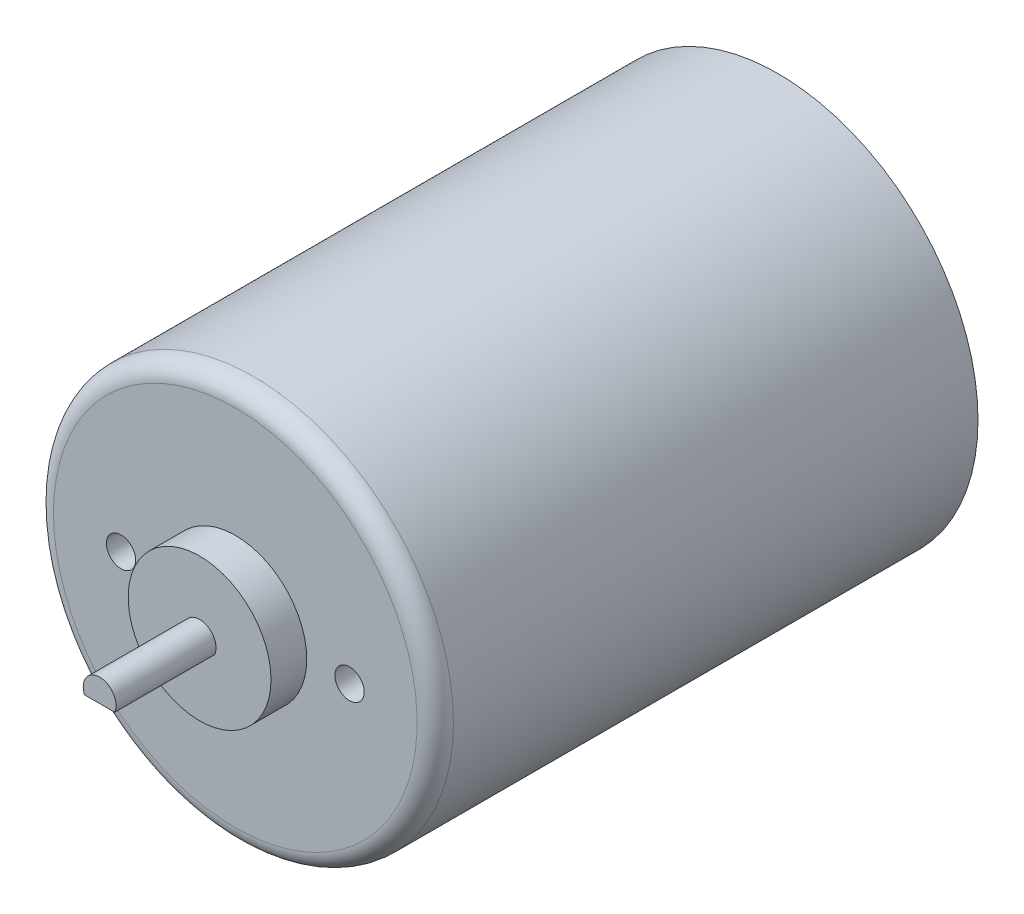
ISO-10303-21;
HEADER;
FILE_DESCRIPTION(('STEP AP214'),'2;1');
FILE_NAME('part.step','',(''),(''),'','','');
FILE_SCHEMA(('AUTOMOTIVE_DESIGN { 1 0 10303 214 1 1 1 1 }'));
ENDSEC;
DATA;
#1=APPLICATION_CONTEXT('core data for automotive mechanical design processes');
#2=APPLICATION_PROTOCOL_DEFINITION('international standard','automotive_design',2000,#1);
#3=PRODUCT_CONTEXT('',#1,'mechanical');
#4=PRODUCT('Part','Part','',(#3));
#5=PRODUCT_RELATED_PRODUCT_CATEGORY('part','',(#4));
#6=PRODUCT_DEFINITION_FORMATION('','',#4);
#7=PRODUCT_DEFINITION_CONTEXT('part definition',#1,'design');
#8=PRODUCT_DEFINITION('design','',#6,#7);
#9=PRODUCT_DEFINITION_SHAPE('','',#8);
#10=(LENGTH_UNIT() NAMED_UNIT(*) SI_UNIT(.MILLI.,.METRE.));
#11=(NAMED_UNIT(*) PLANE_ANGLE_UNIT() SI_UNIT($,.RADIAN.));
#12=(NAMED_UNIT(*) SI_UNIT($,.STERADIAN.) SOLID_ANGLE_UNIT());
#13=UNCERTAINTY_MEASURE_WITH_UNIT(LENGTH_MEASURE(1.E-05),#10,'distance_accuracy_value','');
#14=(GEOMETRIC_REPRESENTATION_CONTEXT(3) GLOBAL_UNCERTAINTY_ASSIGNED_CONTEXT((#13)) GLOBAL_UNIT_ASSIGNED_CONTEXT((#10,
#11,#12)) REPRESENTATION_CONTEXT('',''));
#15=CARTESIAN_POINT('',(0.,0.,0.));
#16=DIRECTION('',(0.,0.,1.));
#17=DIRECTION('',(1.,0.,0.));
#18=AXIS2_PLACEMENT_3D('',#15,#16,#17);
#19=CARTESIAN_POINT('',(0.,0.,2.5));
#20=DIRECTION('',(0.,0.,-1.));
#21=DIRECTION('',(-1.,0.,0.));
#22=AXIS2_PLACEMENT_3D('',#19,#20,#21);
#23=PLANE('',#22);
#24=CARTESIAN_POINT('',(0.,0.,2.5));
#25=DIRECTION('',(0.,0.,1.));
#26=DIRECTION('',(1.,0.,0.));
#27=AXIS2_PLACEMENT_3D('',#24,#25,#26);
#28=CIRCLE('',#27,5.);
#29=CARTESIAN_POINT('',(5.,0.,2.5));
#30=VERTEX_POINT('',#29);
#31=EDGE_CURVE('E135',#30,#30,#28,.T.);
#32=ORIENTED_EDGE('',*,*,#31,.T.);
#33=EDGE_LOOP('',(#32));
#34=FACE_BOUND('',#33,.T.);
#35=CARTESIAN_POINT('',(0.,0.,2.5));
#36=DIRECTION('',(0.,0.,1.));
#37=DIRECTION('',(1.,0.,0.));
#38=AXIS2_PLACEMENT_3D('',#35,#36,#37);
#39=CIRCLE('',#38,1.15);
#40=CARTESIAN_POINT('',(1.05830052442584,-0.450000000000006,2.5));
#41=VERTEX_POINT('',#40);
#42=CARTESIAN_POINT('',(-1.05830052442584,-0.450000000000006,2.5));
#43=VERTEX_POINT('',#42);
#44=EDGE_CURVE('E79',#41,#43,#39,.T.);
#45=ORIENTED_EDGE('',*,*,#44,.F.);
#46=DIRECTION('',(1.,0.,0.));
#47=VECTOR('',#46,1.);
#48=CARTESIAN_POINT('',(-1.05830052442584,-0.450000000000006,2.5));
#49=LINE('',#48,#47);
#50=EDGE_CURVE('E64',#43,#41,#49,.T.);
#51=ORIENTED_EDGE('',*,*,#50,.F.);
#52=EDGE_LOOP('',(#45,#51));
#53=FACE_BOUND('',#52,.T.);
#54=ADVANCED_FACE('F49',(#34,#53),#23,.F.);
#55=CARTESIAN_POINT('',(0.,0.,0.));
#56=DIRECTION('',(0.,0.,1.));
#57=DIRECTION('',(1.,0.,0.));
#58=AXIS2_PLACEMENT_3D('',#55,#56,#57);
#59=CYLINDRICAL_SURFACE('',#58,5.);
#60=ORIENTED_EDGE('',*,*,#31,.F.);
#61=EDGE_LOOP('',(#60));
#62=FACE_BOUND('',#61,.T.);
#63=CARTESIAN_POINT('',(0.,0.,0.));
#64=DIRECTION('',(0.,0.,1.));
#65=DIRECTION('',(1.,0.,0.));
#66=AXIS2_PLACEMENT_3D('',#63,#64,#65);
#67=CIRCLE('',#66,5.);
#68=CARTESIAN_POINT('',(5.,0.,0.));
#69=VERTEX_POINT('',#68);
#70=EDGE_CURVE('E131',#69,#69,#67,.T.);
#71=ORIENTED_EDGE('',*,*,#70,.T.);
#72=EDGE_LOOP('',(#71));
#73=FACE_BOUND('',#72,.T.);
#74=ADVANCED_FACE('F154',(#62,#73),#59,.T.);
#75=CARTESIAN_POINT('',(0.,5.,0.));
#76=DIRECTION('',(0.,0.,-1.));
#77=DIRECTION('',(-1.,0.,0.));
#78=AXIS2_PLACEMENT_3D('',#75,#76,#77);
#79=PLANE('',#78);
#80=CARTESIAN_POINT('',(0.,0.,0.));
#81=DIRECTION('',(0.,0.,-1.));
#82=DIRECTION('',(-1.,0.,0.));
#83=AXIS2_PLACEMENT_3D('',#80,#81,#82);
#84=CIRCLE('',#83,12.73);
#85=CARTESIAN_POINT('',(-12.73,0.,0.));
#86=VERTEX_POINT('',#85);
#87=EDGE_CURVE('E58',#86,#86,#84,.F.);
#88=ORIENTED_EDGE('',*,*,#87,.T.);
#89=EDGE_LOOP('',(#88));
#90=FACE_BOUND('',#89,.T.);
#91=CARTESIAN_POINT('',(8.,0.,0.));
#92=DIRECTION('',(0.,0.,1.));
#93=DIRECTION('',(1.,0.,0.));
#94=AXIS2_PLACEMENT_3D('',#91,#92,#93);
#95=CIRCLE('',#94,1.02499999999999);
#96=CARTESIAN_POINT('',(9.02499999999999,0.,0.));
#97=VERTEX_POINT('',#96);
#98=EDGE_CURVE('E98',#97,#97,#95,.T.);
#99=ORIENTED_EDGE('',*,*,#98,.F.);
#100=EDGE_LOOP('',(#99));
#101=FACE_BOUND('',#100,.T.);
#102=CARTESIAN_POINT('',(-8.,0.,0.));
#103=DIRECTION('',(0.,0.,1.));
#104=DIRECTION('',(1.,0.,0.));
#105=AXIS2_PLACEMENT_3D('',#102,#103,#104);
#106=CIRCLE('',#105,1.02499999999999);
#107=CARTESIAN_POINT('',(-6.97500000000001,0.,0.));
#108=VERTEX_POINT('',#107);
#109=EDGE_CURVE('E97',#108,#108,#106,.T.);
#110=ORIENTED_EDGE('',*,*,#109,.F.);
#111=EDGE_LOOP('',(#110));
#112=FACE_BOUND('',#111,.T.);
#113=ORIENTED_EDGE('',*,*,#70,.F.);
#114=EDGE_LOOP('',(#113));
#115=FACE_BOUND('',#114,.T.);
#116=ADVANCED_FACE('F142',(#90,#101,#112,#115),#79,.F.);
#117=CARTESIAN_POINT('',(0.,0.,0.));
#118=DIRECTION('',(0.,0.,1.));
#119=DIRECTION('',(1.,0.,0.));
#120=AXIS2_PLACEMENT_3D('',#117,#118,#119);
#121=CYLINDRICAL_SURFACE('',#120,14.);
#122=CARTESIAN_POINT('',(0.,0.,-1.26999999999999));
#123=DIRECTION('',(0.,0.,-1.));
#124=DIRECTION('',(-1.,0.,0.));
#125=AXIS2_PLACEMENT_3D('',#122,#123,#124);
#126=CIRCLE('',#125,14.);
#127=CARTESIAN_POINT('',(-14.,0.,-1.26999999999999));
#128=VERTEX_POINT('',#127);
#129=EDGE_CURVE('E11',#128,#128,#126,.T.);
#130=ORIENTED_EDGE('',*,*,#129,.T.);
#131=EDGE_LOOP('',(#130));
#132=FACE_BOUND('',#131,.T.);
#133=CARTESIAN_POINT('',(0.,0.,-38.));
#134=DIRECTION('',(0.,0.,1.));
#135=DIRECTION('',(1.,0.,0.));
#136=AXIS2_PLACEMENT_3D('',#133,#134,#135);
#137=CIRCLE('',#136,14.);
#138=CARTESIAN_POINT('',(14.,0.,-38.));
#139=VERTEX_POINT('',#138);
#140=EDGE_CURVE('E127',#139,#139,#137,.T.);
#141=ORIENTED_EDGE('',*,*,#140,.T.);
#142=EDGE_LOOP('',(#141));
#143=FACE_BOUND('',#142,.T.);
#144=ADVANCED_FACE('F164',(#132,#143),#121,.T.);
#145=CARTESIAN_POINT('',(0.,14.,-38.));
#146=DIRECTION('',(0.,0.,1.));
#147=DIRECTION('',(1.,0.,0.));
#148=AXIS2_PLACEMENT_3D('',#145,#146,#147);
#149=PLANE('',#148);
#150=ORIENTED_EDGE('',*,*,#140,.F.);
#151=EDGE_LOOP('',(#150));
#152=FACE_BOUND('',#151,.T.);
#153=ADVANCED_FACE('F167',(#152),#149,.F.);
#154=CARTESIAN_POINT('',(0.,0.,9.50000000000001));
#155=DIRECTION('',(0.,0.,-1.));
#156=DIRECTION('',(-1.,0.,0.));
#157=AXIS2_PLACEMENT_3D('',#154,#155,#156);
#158=CYLINDRICAL_SURFACE('',#157,1.15);
#159=ORIENTED_EDGE('',*,*,#44,.T.);
#160=DIRECTION('',(0.,0.,-1.));
#161=VECTOR('',#160,1.);
#162=CARTESIAN_POINT('',(-1.05830052442584,-0.450000000000006,9.50000000000001));
#163=LINE('',#162,#161);
#164=CARTESIAN_POINT('',(-1.05830052442584,-0.450000000000006,9.50000000000001));
#165=VERTEX_POINT('',#164);
#166=EDGE_CURVE('E124',#165,#43,#163,.T.);
#167=ORIENTED_EDGE('',*,*,#166,.F.);
#168=CARTESIAN_POINT('',(0.,0.,9.50000000000001));
#169=DIRECTION('',(0.,0.,1.));
#170=DIRECTION('',(1.,0.,0.));
#171=AXIS2_PLACEMENT_3D('',#168,#169,#170);
#172=CIRCLE('',#171,1.15);
#173=CARTESIAN_POINT('',(1.05830052442584,-0.450000000000006,9.50000000000001));
#174=VERTEX_POINT('',#173);
#175=EDGE_CURVE('E111',#174,#165,#172,.T.);
#176=ORIENTED_EDGE('',*,*,#175,.F.);
#177=DIRECTION('',(0.,0.,-1.));
#178=VECTOR('',#177,1.);
#179=CARTESIAN_POINT('',(1.05830052442584,-0.450000000000006,9.50000000000001));
#180=LINE('',#179,#178);
#181=EDGE_CURVE('E116',#174,#41,#180,.T.);
#182=ORIENTED_EDGE('',*,*,#181,.T.);
#183=EDGE_LOOP('',(#159,#167,#176,#182));
#184=FACE_BOUND('',#183,.T.);
#185=ADVANCED_FACE('F171',(#184),#158,.T.);
#186=CARTESIAN_POINT('',(-1.05830052442584,-0.450000000000006,9.50000000000001));
#187=DIRECTION('',(0.,1.,0.));
#188=DIRECTION('',(0.,0.,1.));
#189=AXIS2_PLACEMENT_3D('',#186,#187,#188);
#190=PLANE('',#189);
#191=ORIENTED_EDGE('',*,*,#50,.T.);
#192=ORIENTED_EDGE('',*,*,#181,.F.);
#193=DIRECTION('',(1.,0.,0.));
#194=VECTOR('',#193,1.);
#195=CARTESIAN_POINT('',(-1.05830052442584,-0.450000000000006,9.50000000000001));
#196=LINE('',#195,#194);
#197=EDGE_CURVE('E72',#165,#174,#196,.T.);
#198=ORIENTED_EDGE('',*,*,#197,.F.);
#199=ORIENTED_EDGE('',*,*,#166,.T.);
#200=EDGE_LOOP('',(#191,#192,#198,#199));
#201=FACE_BOUND('',#200,.T.);
#202=ADVANCED_FACE('F175',(#201),#190,.F.);
#203=CARTESIAN_POINT('',(0.,0.,9.50000000000001));
#204=DIRECTION('',(0.,0.,1.));
#205=DIRECTION('',(1.,0.,0.));
#206=AXIS2_PLACEMENT_3D('',#203,#204,#205);
#207=PLANE('',#206);
#208=ORIENTED_EDGE('',*,*,#175,.T.);
#209=ORIENTED_EDGE('',*,*,#197,.T.);
#210=EDGE_LOOP('',(#208,#209));
#211=FACE_BOUND('',#210,.T.);
#212=ADVANCED_FACE('F179',(#211),#207,.T.);
#213=CARTESIAN_POINT('',(-8.,0.,-6.42619999999999));
#214=DIRECTION('',(0.,0.,1.));
#215=DIRECTION('',(1.,0.,0.));
#216=AXIS2_PLACEMENT_3D('',#213,#214,#215);
#217=CONICAL_SURFACE('',#216,1.02499999999999,1.02974425867664);
#218=CARTESIAN_POINT('',(-8.,0.,-7.04208213450325));
#219=VERTEX_POINT('',#218);
#220=VERTEX_LOOP('',#219);
#221=FACE_BOUND('',#220,.T.);
#222=CARTESIAN_POINT('',(-8.,0.,-6.42619999999999));
#223=DIRECTION('',(0.,0.,1.));
#224=DIRECTION('',(1.,0.,0.));
#225=AXIS2_PLACEMENT_3D('',#222,#223,#224);
#226=CIRCLE('',#225,1.02499999999999);
#227=CARTESIAN_POINT('',(-6.97500000000001,0.,-6.42619999999999));
#228=VERTEX_POINT('',#227);
#229=EDGE_CURVE('E103',#228,#228,#226,.T.);
#230=ORIENTED_EDGE('',*,*,#229,.T.);
#231=EDGE_LOOP('',(#230));
#232=FACE_BOUND('',#231,.T.);
#233=ADVANCED_FACE('F183',(#221,#232),#217,.F.);
#234=CARTESIAN_POINT('',(-8.,0.,0.));
#235=DIRECTION('',(0.,0.,1.));
#236=DIRECTION('',(1.,0.,0.));
#237=AXIS2_PLACEMENT_3D('',#234,#235,#236);
#238=CYLINDRICAL_SURFACE('',#237,1.02499999999999);
#239=ORIENTED_EDGE('',*,*,#229,.F.);
#240=EDGE_LOOP('',(#239));
#241=FACE_BOUND('',#240,.T.);
#242=ORIENTED_EDGE('',*,*,#109,.T.);
#243=EDGE_LOOP('',(#242));
#244=FACE_BOUND('',#243,.T.);
#245=ADVANCED_FACE('F90',(#241,#244),#238,.F.);
#246=CARTESIAN_POINT('',(8.,0.,-6.42619999999999));
#247=DIRECTION('',(0.,0.,1.));
#248=DIRECTION('',(1.,0.,0.));
#249=AXIS2_PLACEMENT_3D('',#246,#247,#248);
#250=CONICAL_SURFACE('',#249,1.02499999999999,1.02974425867664);
#251=CARTESIAN_POINT('',(8.,0.,-7.04208213450325));
#252=VERTEX_POINT('',#251);
#253=VERTEX_LOOP('',#252);
#254=FACE_BOUND('',#253,.T.);
#255=CARTESIAN_POINT('',(8.,0.,-6.42619999999999));
#256=DIRECTION('',(0.,0.,1.));
#257=DIRECTION('',(1.,0.,0.));
#258=AXIS2_PLACEMENT_3D('',#255,#256,#257);
#259=CIRCLE('',#258,1.02499999999999);
#260=CARTESIAN_POINT('',(9.02499999999999,0.,-6.42619999999999));
#261=VERTEX_POINT('',#260);
#262=EDGE_CURVE('E94',#261,#261,#259,.T.);
#263=ORIENTED_EDGE('',*,*,#262,.T.);
#264=EDGE_LOOP('',(#263));
#265=FACE_BOUND('',#264,.T.);
#266=ADVANCED_FACE('F86',(#254,#265),#250,.F.);
#267=CARTESIAN_POINT('',(8.,0.,0.));
#268=DIRECTION('',(0.,0.,1.));
#269=DIRECTION('',(1.,0.,0.));
#270=AXIS2_PLACEMENT_3D('',#267,#268,#269);
#271=CYLINDRICAL_SURFACE('',#270,1.02499999999999);
#272=ORIENTED_EDGE('',*,*,#262,.F.);
#273=EDGE_LOOP('',(#272));
#274=FACE_BOUND('',#273,.T.);
#275=ORIENTED_EDGE('',*,*,#98,.T.);
#276=EDGE_LOOP('',(#275));
#277=FACE_BOUND('',#276,.T.);
#278=ADVANCED_FACE('F89',(#274,#277),#271,.F.);
#279=CARTESIAN_POINT('',(0.,0.,-1.26999999999999));
#280=DIRECTION('',(0.,0.,-1.));
#281=DIRECTION('',(-1.,0.,0.));
#282=AXIS2_PLACEMENT_3D('',#279,#280,#281);
#283=TOROIDAL_SURFACE('',#282,12.73,1.27);
#284=ORIENTED_EDGE('',*,*,#129,.F.);
#285=EDGE_LOOP('',(#284));
#286=FACE_BOUND('',#285,.T.);
#287=ORIENTED_EDGE('',*,*,#87,.F.);
#288=EDGE_LOOP('',(#287));
#289=FACE_BOUND('',#288,.T.);
#290=ADVANCED_FACE('F51',(#286,#289),#283,.T.);
#291=CLOSED_SHELL('',(#54,#74,#116,#144,#153,#185,#202,#212,#233,#245,#266,#278,#290));
#292=MANIFOLD_SOLID_BREP('B2',#291);
#293=ADVANCED_BREP_SHAPE_REPRESENTATION('',(#18,#292),#14);
#294=SHAPE_DEFINITION_REPRESENTATION(#9,#293);
ENDSEC;
END-ISO-10303-21;
